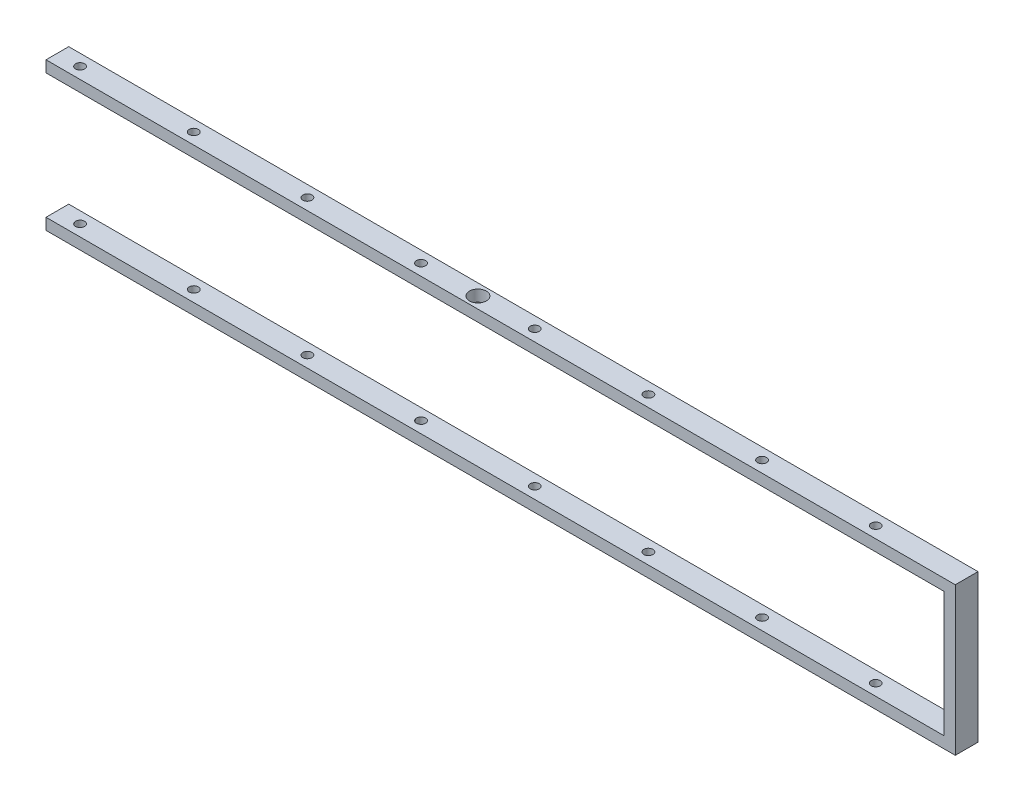
ISO-10303-21;
HEADER;
FILE_DESCRIPTION(('STEP AP214'),'2;1');
FILE_NAME('part.step','',(''),(''),'','','');
FILE_SCHEMA(('AUTOMOTIVE_DESIGN { 1 0 10303 214 1 1 1 1 }'));
ENDSEC;
DATA;
#1=APPLICATION_CONTEXT('core data for automotive mechanical design processes');
#2=APPLICATION_PROTOCOL_DEFINITION('international standard','automotive_design',2000,#1);
#3=PRODUCT_CONTEXT('',#1,'mechanical');
#4=PRODUCT('Part','Part','',(#3));
#5=PRODUCT_RELATED_PRODUCT_CATEGORY('part','',(#4));
#6=PRODUCT_DEFINITION_FORMATION('','',#4);
#7=PRODUCT_DEFINITION_CONTEXT('part definition',#1,'design');
#8=PRODUCT_DEFINITION('design','',#6,#7);
#9=PRODUCT_DEFINITION_SHAPE('','',#8);
#10=(LENGTH_UNIT() NAMED_UNIT(*) SI_UNIT(.MILLI.,.METRE.));
#11=(NAMED_UNIT(*) PLANE_ANGLE_UNIT() SI_UNIT($,.RADIAN.));
#12=(NAMED_UNIT(*) SI_UNIT($,.STERADIAN.) SOLID_ANGLE_UNIT());
#13=UNCERTAINTY_MEASURE_WITH_UNIT(LENGTH_MEASURE(1.E-05),#10,'distance_accuracy_value','');
#14=(GEOMETRIC_REPRESENTATION_CONTEXT(3) GLOBAL_UNCERTAINTY_ASSIGNED_CONTEXT((#13)) GLOBAL_UNIT_ASSIGNED_CONTEXT((#10,
#11,#12)) REPRESENTATION_CONTEXT('',''));
#15=CARTESIAN_POINT('',(0.,0.,0.));
#16=DIRECTION('',(0.,0.,1.));
#17=DIRECTION('',(1.,0.,0.));
#18=AXIS2_PLACEMENT_3D('',#15,#16,#17);
#19=CARTESIAN_POINT('',(0.,10.,20.));
#20=DIRECTION('',(0.,1.,0.));
#21=DIRECTION('',(0.,0.,1.));
#22=AXIS2_PLACEMENT_3D('',#19,#20,#21);
#23=PLANE('',#22);
#24=CARTESIAN_POINT('',(720.,10.,10.));
#25=DIRECTION('',(0.,1.,0.));
#26=DIRECTION('',(0.,0.,1.));
#27=AXIS2_PLACEMENT_3D('',#24,#25,#26);
#28=CIRCLE('',#27,4.);
#29=CARTESIAN_POINT('',(720.,10.,14.));
#30=VERTEX_POINT('',#29);
#31=EDGE_CURVE('E196',#30,#30,#28,.T.);
#32=ORIENTED_EDGE('',*,*,#31,.F.);
#33=EDGE_LOOP('',(#32));
#34=FACE_BOUND('',#33,.T.);
#35=CARTESIAN_POINT('',(620.,10.,10.));
#36=DIRECTION('',(0.,1.,0.));
#37=DIRECTION('',(0.,0.,1.));
#38=AXIS2_PLACEMENT_3D('',#35,#36,#37);
#39=CIRCLE('',#38,4.);
#40=CARTESIAN_POINT('',(620.,10.,14.));
#41=VERTEX_POINT('',#40);
#42=EDGE_CURVE('E190',#41,#41,#39,.T.);
#43=ORIENTED_EDGE('',*,*,#42,.F.);
#44=EDGE_LOOP('',(#43));
#45=FACE_BOUND('',#44,.T.);
#46=CARTESIAN_POINT('',(520.,10.,10.));
#47=DIRECTION('',(0.,1.,0.));
#48=DIRECTION('',(0.,0.,1.));
#49=AXIS2_PLACEMENT_3D('',#46,#47,#48);
#50=CIRCLE('',#49,4.);
#51=CARTESIAN_POINT('',(520.,10.,14.));
#52=VERTEX_POINT('',#51);
#53=EDGE_CURVE('E184',#52,#52,#50,.T.);
#54=ORIENTED_EDGE('',*,*,#53,.F.);
#55=EDGE_LOOP('',(#54));
#56=FACE_BOUND('',#55,.T.);
#57=CARTESIAN_POINT('',(420.,10.,10.));
#58=DIRECTION('',(0.,1.,0.));
#59=DIRECTION('',(0.,0.,1.));
#60=AXIS2_PLACEMENT_3D('',#57,#58,#59);
#61=CIRCLE('',#60,4.);
#62=CARTESIAN_POINT('',(420.,10.,14.));
#63=VERTEX_POINT('',#62);
#64=EDGE_CURVE('E178',#63,#63,#61,.T.);
#65=ORIENTED_EDGE('',*,*,#64,.F.);
#66=EDGE_LOOP('',(#65));
#67=FACE_BOUND('',#66,.T.);
#68=CARTESIAN_POINT('',(320.,10.,10.));
#69=DIRECTION('',(0.,1.,0.));
#70=DIRECTION('',(0.,0.,1.));
#71=AXIS2_PLACEMENT_3D('',#68,#69,#70);
#72=CIRCLE('',#71,4.);
#73=CARTESIAN_POINT('',(320.,10.,14.));
#74=VERTEX_POINT('',#73);
#75=EDGE_CURVE('E172',#74,#74,#72,.T.);
#76=ORIENTED_EDGE('',*,*,#75,.F.);
#77=EDGE_LOOP('',(#76));
#78=FACE_BOUND('',#77,.T.);
#79=CARTESIAN_POINT('',(220.,10.,10.));
#80=DIRECTION('',(0.,1.,0.));
#81=DIRECTION('',(0.,0.,1.));
#82=AXIS2_PLACEMENT_3D('',#79,#80,#81);
#83=CIRCLE('',#82,4.);
#84=CARTESIAN_POINT('',(220.,10.,14.));
#85=VERTEX_POINT('',#84);
#86=EDGE_CURVE('E166',#85,#85,#83,.T.);
#87=ORIENTED_EDGE('',*,*,#86,.F.);
#88=EDGE_LOOP('',(#87));
#89=FACE_BOUND('',#88,.T.);
#90=CARTESIAN_POINT('',(120.,10.,10.));
#91=DIRECTION('',(0.,1.,0.));
#92=DIRECTION('',(0.,0.,1.));
#93=AXIS2_PLACEMENT_3D('',#90,#91,#92);
#94=CIRCLE('',#93,4.);
#95=CARTESIAN_POINT('',(120.,10.,14.));
#96=VERTEX_POINT('',#95);
#97=EDGE_CURVE('E160',#96,#96,#94,.T.);
#98=ORIENTED_EDGE('',*,*,#97,.F.);
#99=EDGE_LOOP('',(#98));
#100=FACE_BOUND('',#99,.T.);
#101=CARTESIAN_POINT('',(20.,10.,10.));
#102=DIRECTION('',(0.,1.,0.));
#103=DIRECTION('',(0.,0.,1.));
#104=AXIS2_PLACEMENT_3D('',#101,#102,#103);
#105=CIRCLE('',#104,4.);
#106=CARTESIAN_POINT('',(20.,10.,14.));
#107=VERTEX_POINT('',#106);
#108=EDGE_CURVE('E147',#107,#107,#105,.T.);
#109=ORIENTED_EDGE('',*,*,#108,.F.);
#110=EDGE_LOOP('',(#109));
#111=FACE_BOUND('',#110,.T.);
#112=DIRECTION('',(1.,0.,0.));
#113=VECTOR('',#112,1.);
#114=CARTESIAN_POINT('',(0.,10.,0.));
#115=LINE('',#114,#113);
#116=CARTESIAN_POINT('',(0.,10.,0.));
#117=VERTEX_POINT('',#116);
#118=CARTESIAN_POINT('',(790.,10.,0.));
#119=VERTEX_POINT('',#118);
#120=EDGE_CURVE('E150',#117,#119,#115,.T.);
#121=ORIENTED_EDGE('',*,*,#120,.F.);
#122=DIRECTION('',(0.,0.,-1.));
#123=VECTOR('',#122,1.);
#124=CARTESIAN_POINT('',(0.,10.,20.));
#125=LINE('',#124,#123);
#126=CARTESIAN_POINT('',(0.,10.,20.));
#127=VERTEX_POINT('',#126);
#128=EDGE_CURVE('E11',#127,#117,#125,.T.);
#129=ORIENTED_EDGE('',*,*,#128,.F.);
#130=DIRECTION('',(1.,0.,0.));
#131=VECTOR('',#130,1.);
#132=CARTESIAN_POINT('',(0.,10.,20.));
#133=LINE('',#132,#131);
#134=CARTESIAN_POINT('',(790.,10.,20.));
#135=VERTEX_POINT('',#134);
#136=EDGE_CURVE('E139',#127,#135,#133,.T.);
#137=ORIENTED_EDGE('',*,*,#136,.T.);
#138=DIRECTION('',(0.,0.,-1.));
#139=VECTOR('',#138,1.);
#140=CARTESIAN_POINT('',(790.,10.,20.));
#141=LINE('',#140,#139);
#142=EDGE_CURVE('E59',#135,#119,#141,.T.);
#143=ORIENTED_EDGE('',*,*,#142,.T.);
#144=EDGE_LOOP('',(#121,#129,#137,#143));
#145=FACE_BOUND('',#144,.T.);
#146=ADVANCED_FACE('F42',(#34,#45,#56,#67,#78,#89,#100,#111,#145),#23,.T.);
#147=CARTESIAN_POINT('',(0.,0.,20.));
#148=DIRECTION('',(-1.,0.,0.));
#149=DIRECTION('',(0.,0.,1.));
#150=AXIS2_PLACEMENT_3D('',#147,#148,#149);
#151=PLANE('',#150);
#152=DIRECTION('',(0.,1.,0.));
#153=VECTOR('',#152,1.);
#154=CARTESIAN_POINT('',(0.,0.,0.));
#155=LINE('',#154,#153);
#156=CARTESIAN_POINT('',(0.,0.,0.));
#157=VERTEX_POINT('',#156);
#158=EDGE_CURVE('E290',#157,#117,#155,.T.);
#159=ORIENTED_EDGE('',*,*,#158,.F.);
#160=DIRECTION('',(0.,0.,-1.));
#161=VECTOR('',#160,1.);
#162=CARTESIAN_POINT('',(0.,0.,20.));
#163=LINE('',#162,#161);
#164=CARTESIAN_POINT('',(0.,0.,20.));
#165=VERTEX_POINT('',#164);
#166=EDGE_CURVE('E51',#165,#157,#163,.T.);
#167=ORIENTED_EDGE('',*,*,#166,.F.);
#168=DIRECTION('',(0.,1.,0.));
#169=VECTOR('',#168,1.);
#170=CARTESIAN_POINT('',(0.,0.,20.));
#171=LINE('',#170,#169);
#172=EDGE_CURVE('E132',#165,#127,#171,.T.);
#173=ORIENTED_EDGE('',*,*,#172,.T.);
#174=ORIENTED_EDGE('',*,*,#128,.T.);
#175=EDGE_LOOP('',(#159,#167,#173,#174));
#176=FACE_BOUND('',#175,.T.);
#177=ADVANCED_FACE('F312',(#176),#151,.T.);
#178=CARTESIAN_POINT('',(0.,0.,20.));
#179=DIRECTION('',(0.,1.,0.));
#180=DIRECTION('',(0.,0.,1.));
#181=AXIS2_PLACEMENT_3D('',#178,#179,#180);
#182=PLANE('',#181);
#183=CARTESIAN_POINT('',(720.,0.,10.));
#184=DIRECTION('',(0.,1.,0.));
#185=DIRECTION('',(0.,0.,1.));
#186=AXIS2_PLACEMENT_3D('',#183,#184,#185);
#187=CIRCLE('',#186,4.);
#188=CARTESIAN_POINT('',(720.,0.,14.));
#189=VERTEX_POINT('',#188);
#190=EDGE_CURVE('E193',#189,#189,#187,.T.);
#191=ORIENTED_EDGE('',*,*,#190,.T.);
#192=EDGE_LOOP('',(#191));
#193=FACE_BOUND('',#192,.T.);
#194=CARTESIAN_POINT('',(620.,0.,10.));
#195=DIRECTION('',(0.,1.,0.));
#196=DIRECTION('',(0.,0.,1.));
#197=AXIS2_PLACEMENT_3D('',#194,#195,#196);
#198=CIRCLE('',#197,4.);
#199=CARTESIAN_POINT('',(620.,0.,14.));
#200=VERTEX_POINT('',#199);
#201=EDGE_CURVE('E187',#200,#200,#198,.T.);
#202=ORIENTED_EDGE('',*,*,#201,.T.);
#203=EDGE_LOOP('',(#202));
#204=FACE_BOUND('',#203,.T.);
#205=CARTESIAN_POINT('',(520.,0.,10.));
#206=DIRECTION('',(0.,1.,0.));
#207=DIRECTION('',(0.,0.,1.));
#208=AXIS2_PLACEMENT_3D('',#205,#206,#207);
#209=CIRCLE('',#208,4.);
#210=CARTESIAN_POINT('',(520.,0.,14.));
#211=VERTEX_POINT('',#210);
#212=EDGE_CURVE('E181',#211,#211,#209,.T.);
#213=ORIENTED_EDGE('',*,*,#212,.T.);
#214=EDGE_LOOP('',(#213));
#215=FACE_BOUND('',#214,.T.);
#216=CARTESIAN_POINT('',(420.,0.,10.));
#217=DIRECTION('',(0.,1.,0.));
#218=DIRECTION('',(0.,0.,1.));
#219=AXIS2_PLACEMENT_3D('',#216,#217,#218);
#220=CIRCLE('',#219,4.);
#221=CARTESIAN_POINT('',(420.,0.,14.));
#222=VERTEX_POINT('',#221);
#223=EDGE_CURVE('E175',#222,#222,#220,.T.);
#224=ORIENTED_EDGE('',*,*,#223,.T.);
#225=EDGE_LOOP('',(#224));
#226=FACE_BOUND('',#225,.T.);
#227=CARTESIAN_POINT('',(320.,0.,10.));
#228=DIRECTION('',(0.,1.,0.));
#229=DIRECTION('',(0.,0.,1.));
#230=AXIS2_PLACEMENT_3D('',#227,#228,#229);
#231=CIRCLE('',#230,4.);
#232=CARTESIAN_POINT('',(320.,0.,14.));
#233=VERTEX_POINT('',#232);
#234=EDGE_CURVE('E169',#233,#233,#231,.T.);
#235=ORIENTED_EDGE('',*,*,#234,.T.);
#236=EDGE_LOOP('',(#235));
#237=FACE_BOUND('',#236,.T.);
#238=CARTESIAN_POINT('',(220.,0.,10.));
#239=DIRECTION('',(0.,1.,0.));
#240=DIRECTION('',(0.,0.,1.));
#241=AXIS2_PLACEMENT_3D('',#238,#239,#240);
#242=CIRCLE('',#241,4.);
#243=CARTESIAN_POINT('',(220.,0.,14.));
#244=VERTEX_POINT('',#243);
#245=EDGE_CURVE('E163',#244,#244,#242,.T.);
#246=ORIENTED_EDGE('',*,*,#245,.T.);
#247=EDGE_LOOP('',(#246));
#248=FACE_BOUND('',#247,.T.);
#249=CARTESIAN_POINT('',(120.,0.,10.));
#250=DIRECTION('',(0.,1.,0.));
#251=DIRECTION('',(0.,0.,1.));
#252=AXIS2_PLACEMENT_3D('',#249,#250,#251);
#253=CIRCLE('',#252,4.);
#254=CARTESIAN_POINT('',(120.,0.,14.));
#255=VERTEX_POINT('',#254);
#256=EDGE_CURVE('E155',#255,#255,#253,.T.);
#257=ORIENTED_EDGE('',*,*,#256,.T.);
#258=EDGE_LOOP('',(#257));
#259=FACE_BOUND('',#258,.T.);
#260=CARTESIAN_POINT('',(20.,0.,10.));
#261=DIRECTION('',(0.,1.,0.));
#262=DIRECTION('',(0.,0.,1.));
#263=AXIS2_PLACEMENT_3D('',#260,#261,#262);
#264=CIRCLE('',#263,4.);
#265=CARTESIAN_POINT('',(20.,0.,14.));
#266=VERTEX_POINT('',#265);
#267=EDGE_CURVE('E154',#266,#266,#264,.T.);
#268=ORIENTED_EDGE('',*,*,#267,.T.);
#269=EDGE_LOOP('',(#268));
#270=FACE_BOUND('',#269,.T.);
#271=DIRECTION('',(1.,0.,0.));
#272=VECTOR('',#271,1.);
#273=CARTESIAN_POINT('',(0.,0.,0.));
#274=LINE('',#273,#272);
#275=CARTESIAN_POINT('',(800.,0.,0.));
#276=VERTEX_POINT('',#275);
#277=EDGE_CURVE('E295',#157,#276,#274,.T.);
#278=ORIENTED_EDGE('',*,*,#277,.T.);
#279=DIRECTION('',(0.,0.,-1.));
#280=VECTOR('',#279,1.);
#281=CARTESIAN_POINT('',(800.,0.,20.));
#282=LINE('',#281,#280);
#283=CARTESIAN_POINT('',(800.,0.,20.));
#284=VERTEX_POINT('',#283);
#285=EDGE_CURVE('E305',#284,#276,#282,.T.);
#286=ORIENTED_EDGE('',*,*,#285,.F.);
#287=DIRECTION('',(1.,0.,0.));
#288=VECTOR('',#287,1.);
#289=CARTESIAN_POINT('',(0.,0.,20.));
#290=LINE('',#289,#288);
#291=EDGE_CURVE('E138',#165,#284,#290,.T.);
#292=ORIENTED_EDGE('',*,*,#291,.F.);
#293=ORIENTED_EDGE('',*,*,#166,.T.);
#294=EDGE_LOOP('',(#278,#286,#292,#293));
#295=FACE_BOUND('',#294,.T.);
#296=ADVANCED_FACE('F311',(#193,#204,#215,#226,#237,#248,#259,#270,#295),#182,.F.);
#297=CARTESIAN_POINT('',(800.,0.,20.));
#298=DIRECTION('',(-1.,0.,0.));
#299=DIRECTION('',(0.,0.,1.));
#300=AXIS2_PLACEMENT_3D('',#297,#298,#299);
#301=PLANE('',#300);
#302=DIRECTION('',(0.,1.,0.));
#303=VECTOR('',#302,1.);
#304=CARTESIAN_POINT('',(800.,0.,0.));
#305=LINE('',#304,#303);
#306=CARTESIAN_POINT('',(800.,130.,0.));
#307=VERTEX_POINT('',#306);
#308=EDGE_CURVE('E286',#276,#307,#305,.T.);
#309=ORIENTED_EDGE('',*,*,#308,.T.);
#310=DIRECTION('',(0.,0.,-1.));
#311=VECTOR('',#310,1.);
#312=CARTESIAN_POINT('',(800.,130.,20.));
#313=LINE('',#312,#311);
#314=CARTESIAN_POINT('',(800.,130.,20.));
#315=VERTEX_POINT('',#314);
#316=EDGE_CURVE('E282',#315,#307,#313,.T.);
#317=ORIENTED_EDGE('',*,*,#316,.F.);
#318=DIRECTION('',(0.,1.,0.));
#319=VECTOR('',#318,1.);
#320=CARTESIAN_POINT('',(800.,0.,20.));
#321=LINE('',#320,#319);
#322=EDGE_CURVE('E133',#284,#315,#321,.T.);
#323=ORIENTED_EDGE('',*,*,#322,.F.);
#324=ORIENTED_EDGE('',*,*,#285,.T.);
#325=EDGE_LOOP('',(#309,#317,#323,#324));
#326=FACE_BOUND('',#325,.T.);
#327=ADVANCED_FACE('F260',(#326),#301,.F.);
#328=CARTESIAN_POINT('',(0.,130.,20.));
#329=DIRECTION('',(0.,1.,0.));
#330=DIRECTION('',(0.,0.,1.));
#331=AXIS2_PLACEMENT_3D('',#328,#329,#330);
#332=PLANE('',#331);
#333=CARTESIAN_POINT('',(370.,130.,10.));
#334=DIRECTION('',(0.,1.,0.));
#335=DIRECTION('',(0.,0.,1.));
#336=AXIS2_PLACEMENT_3D('',#333,#334,#335);
#337=CIRCLE('',#336,7.50000000000001);
#338=CARTESIAN_POINT('',(370.,130.,17.5));
#339=VERTEX_POINT('',#338);
#340=EDGE_CURVE('E242',#339,#339,#337,.T.);
#341=ORIENTED_EDGE('',*,*,#340,.F.);
#342=EDGE_LOOP('',(#341));
#343=FACE_BOUND('',#342,.T.);
#344=CARTESIAN_POINT('',(720.,130.,10.));
#345=DIRECTION('',(0.,1.,0.));
#346=DIRECTION('',(0.,0.,1.));
#347=AXIS2_PLACEMENT_3D('',#344,#345,#346);
#348=CIRCLE('',#347,4.);
#349=CARTESIAN_POINT('',(720.,130.,14.));
#350=VERTEX_POINT('',#349);
#351=EDGE_CURVE('E238',#350,#350,#348,.T.);
#352=ORIENTED_EDGE('',*,*,#351,.F.);
#353=EDGE_LOOP('',(#352));
#354=FACE_BOUND('',#353,.T.);
#355=CARTESIAN_POINT('',(620.,130.,10.));
#356=DIRECTION('',(0.,1.,0.));
#357=DIRECTION('',(0.,0.,1.));
#358=AXIS2_PLACEMENT_3D('',#355,#356,#357);
#359=CIRCLE('',#358,4.);
#360=CARTESIAN_POINT('',(620.,130.,14.));
#361=VERTEX_POINT('',#360);
#362=EDGE_CURVE('E232',#361,#361,#359,.T.);
#363=ORIENTED_EDGE('',*,*,#362,.F.);
#364=EDGE_LOOP('',(#363));
#365=FACE_BOUND('',#364,.T.);
#366=CARTESIAN_POINT('',(520.,130.,10.));
#367=DIRECTION('',(0.,1.,0.));
#368=DIRECTION('',(0.,0.,1.));
#369=AXIS2_PLACEMENT_3D('',#366,#367,#368);
#370=CIRCLE('',#369,4.);
#371=CARTESIAN_POINT('',(520.,130.,14.));
#372=VERTEX_POINT('',#371);
#373=EDGE_CURVE('E226',#372,#372,#370,.T.);
#374=ORIENTED_EDGE('',*,*,#373,.F.);
#375=EDGE_LOOP('',(#374));
#376=FACE_BOUND('',#375,.T.);
#377=CARTESIAN_POINT('',(420.,130.,10.));
#378=DIRECTION('',(0.,1.,0.));
#379=DIRECTION('',(0.,0.,1.));
#380=AXIS2_PLACEMENT_3D('',#377,#378,#379);
#381=CIRCLE('',#380,4.);
#382=CARTESIAN_POINT('',(420.,130.,14.));
#383=VERTEX_POINT('',#382);
#384=EDGE_CURVE('E220',#383,#383,#381,.T.);
#385=ORIENTED_EDGE('',*,*,#384,.F.);
#386=EDGE_LOOP('',(#385));
#387=FACE_BOUND('',#386,.T.);
#388=CARTESIAN_POINT('',(320.,130.,10.));
#389=DIRECTION('',(0.,1.,0.));
#390=DIRECTION('',(0.,0.,1.));
#391=AXIS2_PLACEMENT_3D('',#388,#389,#390);
#392=CIRCLE('',#391,4.);
#393=CARTESIAN_POINT('',(320.,130.,14.));
#394=VERTEX_POINT('',#393);
#395=EDGE_CURVE('E214',#394,#394,#392,.T.);
#396=ORIENTED_EDGE('',*,*,#395,.F.);
#397=EDGE_LOOP('',(#396));
#398=FACE_BOUND('',#397,.T.);
#399=CARTESIAN_POINT('',(220.,130.,10.));
#400=DIRECTION('',(0.,1.,0.));
#401=DIRECTION('',(0.,0.,1.));
#402=AXIS2_PLACEMENT_3D('',#399,#400,#401);
#403=CIRCLE('',#402,4.);
#404=CARTESIAN_POINT('',(220.,130.,14.));
#405=VERTEX_POINT('',#404);
#406=EDGE_CURVE('E208',#405,#405,#403,.T.);
#407=ORIENTED_EDGE('',*,*,#406,.F.);
#408=EDGE_LOOP('',(#407));
#409=FACE_BOUND('',#408,.T.);
#410=CARTESIAN_POINT('',(120.,130.,10.));
#411=DIRECTION('',(0.,1.,0.));
#412=DIRECTION('',(0.,0.,1.));
#413=AXIS2_PLACEMENT_3D('',#410,#411,#412);
#414=CIRCLE('',#413,4.);
#415=CARTESIAN_POINT('',(120.,130.,14.));
#416=VERTEX_POINT('',#415);
#417=EDGE_CURVE('E202',#416,#416,#414,.T.);
#418=ORIENTED_EDGE('',*,*,#417,.F.);
#419=EDGE_LOOP('',(#418));
#420=FACE_BOUND('',#419,.T.);
#421=CARTESIAN_POINT('',(20.,130.,10.));
#422=DIRECTION('',(0.,1.,0.));
#423=DIRECTION('',(0.,0.,1.));
#424=AXIS2_PLACEMENT_3D('',#421,#422,#423);
#425=CIRCLE('',#424,4.);
#426=CARTESIAN_POINT('',(20.,130.,14.));
#427=VERTEX_POINT('',#426);
#428=EDGE_CURVE('E151',#427,#427,#425,.T.);
#429=ORIENTED_EDGE('',*,*,#428,.F.);
#430=EDGE_LOOP('',(#429));
#431=FACE_BOUND('',#430,.T.);
#432=DIRECTION('',(1.,0.,0.));
#433=VECTOR('',#432,1.);
#434=CARTESIAN_POINT('',(0.,130.,0.));
#435=LINE('',#434,#433);
#436=CARTESIAN_POINT('',(0.,130.,0.));
#437=VERTEX_POINT('',#436);
#438=EDGE_CURVE('E280',#437,#307,#435,.T.);
#439=ORIENTED_EDGE('',*,*,#438,.F.);
#440=DIRECTION('',(0.,0.,-1.));
#441=VECTOR('',#440,1.);
#442=CARTESIAN_POINT('',(0.,130.,20.));
#443=LINE('',#442,#441);
#444=CARTESIAN_POINT('',(0.,130.,20.));
#445=VERTEX_POINT('',#444);
#446=EDGE_CURVE('E119',#445,#437,#443,.T.);
#447=ORIENTED_EDGE('',*,*,#446,.F.);
#448=DIRECTION('',(1.,0.,0.));
#449=VECTOR('',#448,1.);
#450=CARTESIAN_POINT('',(0.,130.,20.));
#451=LINE('',#450,#449);
#452=EDGE_CURVE('E130',#445,#315,#451,.T.);
#453=ORIENTED_EDGE('',*,*,#452,.T.);
#454=ORIENTED_EDGE('',*,*,#316,.T.);
#455=EDGE_LOOP('',(#439,#447,#453,#454));
#456=FACE_BOUND('',#455,.T.);
#457=ADVANCED_FACE('F257',(#343,#354,#365,#376,#387,#398,#409,#420,#431,#456),#332,.T.);
#458=CARTESIAN_POINT('',(0.,120.,0.));
#459=VERTEX_POINT('',#458);
#460=EDGE_CURVE('E116',#459,#437,#155,.T.);
#461=ORIENTED_EDGE('',*,*,#460,.F.);
#462=DIRECTION('',(0.,0.,-1.));
#463=VECTOR('',#462,1.);
#464=CARTESIAN_POINT('',(0.,120.,20.));
#465=LINE('',#464,#463);
#466=CARTESIAN_POINT('',(0.,120.,20.));
#467=VERTEX_POINT('',#466);
#468=EDGE_CURVE('E110',#467,#459,#465,.T.);
#469=ORIENTED_EDGE('',*,*,#468,.F.);
#470=EDGE_CURVE('E114',#467,#445,#171,.T.);
#471=ORIENTED_EDGE('',*,*,#470,.T.);
#472=ORIENTED_EDGE('',*,*,#446,.T.);
#473=EDGE_LOOP('',(#461,#469,#471,#472));
#474=FACE_BOUND('',#473,.T.);
#475=ADVANCED_FACE('F112',(#474),#151,.T.);
#476=CARTESIAN_POINT('',(0.,120.,20.));
#477=DIRECTION('',(0.,1.,0.));
#478=DIRECTION('',(-1.,0.,0.));
#479=AXIS2_PLACEMENT_3D('',#476,#477,#478);
#480=PLANE('',#479);
#481=CARTESIAN_POINT('',(370.,120.,10.));
#482=DIRECTION('',(0.,1.,0.));
#483=DIRECTION('',(0.,0.,1.));
#484=AXIS2_PLACEMENT_3D('',#481,#482,#483);
#485=CIRCLE('',#484,7.50000000000001);
#486=CARTESIAN_POINT('',(370.,120.,17.5));
#487=VERTEX_POINT('',#486);
#488=EDGE_CURVE('E241',#487,#487,#485,.T.);
#489=ORIENTED_EDGE('',*,*,#488,.T.);
#490=EDGE_LOOP('',(#489));
#491=FACE_BOUND('',#490,.T.);
#492=CARTESIAN_POINT('',(720.,120.,10.));
#493=DIRECTION('',(0.,1.,0.));
#494=DIRECTION('',(-1.,0.,0.));
#495=AXIS2_PLACEMENT_3D('',#492,#493,#494);
#496=CIRCLE('',#495,4.);
#497=CARTESIAN_POINT('',(716.,120.,10.));
#498=VERTEX_POINT('',#497);
#499=EDGE_CURVE('E235',#498,#498,#496,.T.);
#500=ORIENTED_EDGE('',*,*,#499,.T.);
#501=EDGE_LOOP('',(#500));
#502=FACE_BOUND('',#501,.T.);
#503=CARTESIAN_POINT('',(620.,120.,10.));
#504=DIRECTION('',(0.,1.,0.));
#505=DIRECTION('',(-1.,0.,0.));
#506=AXIS2_PLACEMENT_3D('',#503,#504,#505);
#507=CIRCLE('',#506,4.);
#508=CARTESIAN_POINT('',(616.,120.,10.));
#509=VERTEX_POINT('',#508);
#510=EDGE_CURVE('E229',#509,#509,#507,.T.);
#511=ORIENTED_EDGE('',*,*,#510,.T.);
#512=EDGE_LOOP('',(#511));
#513=FACE_BOUND('',#512,.T.);
#514=CARTESIAN_POINT('',(520.,120.,10.));
#515=DIRECTION('',(0.,1.,0.));
#516=DIRECTION('',(-1.,0.,0.));
#517=AXIS2_PLACEMENT_3D('',#514,#515,#516);
#518=CIRCLE('',#517,4.);
#519=CARTESIAN_POINT('',(516.,120.,10.));
#520=VERTEX_POINT('',#519);
#521=EDGE_CURVE('E223',#520,#520,#518,.T.);
#522=ORIENTED_EDGE('',*,*,#521,.T.);
#523=EDGE_LOOP('',(#522));
#524=FACE_BOUND('',#523,.T.);
#525=CARTESIAN_POINT('',(420.,120.,10.));
#526=DIRECTION('',(0.,1.,0.));
#527=DIRECTION('',(-1.,0.,0.));
#528=AXIS2_PLACEMENT_3D('',#525,#526,#527);
#529=CIRCLE('',#528,4.);
#530=CARTESIAN_POINT('',(416.,120.,10.));
#531=VERTEX_POINT('',#530);
#532=EDGE_CURVE('E217',#531,#531,#529,.T.);
#533=ORIENTED_EDGE('',*,*,#532,.T.);
#534=EDGE_LOOP('',(#533));
#535=FACE_BOUND('',#534,.T.);
#536=CARTESIAN_POINT('',(320.,120.,10.));
#537=DIRECTION('',(0.,1.,0.));
#538=DIRECTION('',(-1.,0.,0.));
#539=AXIS2_PLACEMENT_3D('',#536,#537,#538);
#540=CIRCLE('',#539,4.);
#541=CARTESIAN_POINT('',(316.,120.,10.));
#542=VERTEX_POINT('',#541);
#543=EDGE_CURVE('E211',#542,#542,#540,.T.);
#544=ORIENTED_EDGE('',*,*,#543,.T.);
#545=EDGE_LOOP('',(#544));
#546=FACE_BOUND('',#545,.T.);
#547=CARTESIAN_POINT('',(220.,120.,10.));
#548=DIRECTION('',(0.,1.,0.));
#549=DIRECTION('',(-1.,0.,0.));
#550=AXIS2_PLACEMENT_3D('',#547,#548,#549);
#551=CIRCLE('',#550,4.);
#552=CARTESIAN_POINT('',(216.,120.,10.));
#553=VERTEX_POINT('',#552);
#554=EDGE_CURVE('E205',#553,#553,#551,.T.);
#555=ORIENTED_EDGE('',*,*,#554,.T.);
#556=EDGE_LOOP('',(#555));
#557=FACE_BOUND('',#556,.T.);
#558=CARTESIAN_POINT('',(120.,120.,10.));
#559=DIRECTION('',(0.,1.,0.));
#560=DIRECTION('',(-1.,0.,0.));
#561=AXIS2_PLACEMENT_3D('',#558,#559,#560);
#562=CIRCLE('',#561,4.);
#563=CARTESIAN_POINT('',(116.,120.,10.));
#564=VERTEX_POINT('',#563);
#565=EDGE_CURVE('E199',#564,#564,#562,.T.);
#566=ORIENTED_EDGE('',*,*,#565,.T.);
#567=EDGE_LOOP('',(#566));
#568=FACE_BOUND('',#567,.T.);
#569=CARTESIAN_POINT('',(20.,120.,10.));
#570=DIRECTION('',(0.,1.,0.));
#571=DIRECTION('',(-1.,0.,0.));
#572=AXIS2_PLACEMENT_3D('',#569,#570,#571);
#573=CIRCLE('',#572,4.);
#574=CARTESIAN_POINT('',(16.,120.,10.));
#575=VERTEX_POINT('',#574);
#576=EDGE_CURVE('E45',#575,#575,#573,.T.);
#577=ORIENTED_EDGE('',*,*,#576,.T.);
#578=EDGE_LOOP('',(#577));
#579=FACE_BOUND('',#578,.T.);
#580=DIRECTION('',(1.,0.,0.));
#581=VECTOR('',#580,1.);
#582=CARTESIAN_POINT('',(0.,120.,0.));
#583=LINE('',#582,#581);
#584=CARTESIAN_POINT('',(790.,120.,0.));
#585=VERTEX_POINT('',#584);
#586=EDGE_CURVE('E144',#459,#585,#583,.T.);
#587=ORIENTED_EDGE('',*,*,#586,.T.);
#588=DIRECTION('',(0.,0.,-1.));
#589=VECTOR('',#588,1.);
#590=CARTESIAN_POINT('',(790.,120.,20.));
#591=LINE('',#590,#589);
#592=CARTESIAN_POINT('',(790.,120.,20.));
#593=VERTEX_POINT('',#592);
#594=EDGE_CURVE('E85',#593,#585,#591,.T.);
#595=ORIENTED_EDGE('',*,*,#594,.F.);
#596=DIRECTION('',(1.,0.,0.));
#597=VECTOR('',#596,1.);
#598=CARTESIAN_POINT('',(0.,120.,20.));
#599=LINE('',#598,#597);
#600=EDGE_CURVE('E121',#467,#593,#599,.T.);
#601=ORIENTED_EDGE('',*,*,#600,.F.);
#602=ORIENTED_EDGE('',*,*,#468,.T.);
#603=EDGE_LOOP('',(#587,#595,#601,#602));
#604=FACE_BOUND('',#603,.T.);
#605=ADVANCED_FACE('F122',(#491,#502,#513,#524,#535,#546,#557,#568,#579,#604),#480,.F.);
#606=CARTESIAN_POINT('',(790.,0.,20.));
#607=DIRECTION('',(-1.,0.,0.));
#608=DIRECTION('',(0.,0.,1.));
#609=AXIS2_PLACEMENT_3D('',#606,#607,#608);
#610=PLANE('',#609);
#611=DIRECTION('',(0.,1.,0.));
#612=VECTOR('',#611,1.);
#613=CARTESIAN_POINT('',(790.,0.,0.));
#614=LINE('',#613,#612);
#615=EDGE_CURVE('E142',#119,#585,#614,.T.);
#616=ORIENTED_EDGE('',*,*,#615,.F.);
#617=ORIENTED_EDGE('',*,*,#142,.F.);
#618=DIRECTION('',(0.,1.,0.));
#619=VECTOR('',#618,1.);
#620=CARTESIAN_POINT('',(790.,0.,20.));
#621=LINE('',#620,#619);
#622=EDGE_CURVE('E125',#135,#593,#621,.T.);
#623=ORIENTED_EDGE('',*,*,#622,.T.);
#624=ORIENTED_EDGE('',*,*,#594,.T.);
#625=EDGE_LOOP('',(#616,#617,#623,#624));
#626=FACE_BOUND('',#625,.T.);
#627=ADVANCED_FACE('F354',(#626),#610,.T.);
#628=CARTESIAN_POINT('',(0.,0.,20.));
#629=DIRECTION('',(0.,0.,1.));
#630=DIRECTION('',(1.,0.,0.));
#631=AXIS2_PLACEMENT_3D('',#628,#629,#630);
#632=PLANE('',#631);
#633=ORIENTED_EDGE('',*,*,#136,.F.);
#634=ORIENTED_EDGE('',*,*,#172,.F.);
#635=ORIENTED_EDGE('',*,*,#291,.T.);
#636=ORIENTED_EDGE('',*,*,#322,.T.);
#637=ORIENTED_EDGE('',*,*,#452,.F.);
#638=ORIENTED_EDGE('',*,*,#470,.F.);
#639=ORIENTED_EDGE('',*,*,#600,.T.);
#640=ORIENTED_EDGE('',*,*,#622,.F.);
#641=EDGE_LOOP('',(#633,#634,#635,#636,#637,#638,#639,#640));
#642=FACE_BOUND('',#641,.T.);
#643=ADVANCED_FACE('F128',(#642),#632,.T.);
#644=CARTESIAN_POINT('',(0.,0.,0.));
#645=DIRECTION('',(0.,0.,1.));
#646=DIRECTION('',(1.,0.,0.));
#647=AXIS2_PLACEMENT_3D('',#644,#645,#646);
#648=PLANE('',#647);
#649=ORIENTED_EDGE('',*,*,#120,.T.);
#650=ORIENTED_EDGE('',*,*,#615,.T.);
#651=ORIENTED_EDGE('',*,*,#586,.F.);
#652=ORIENTED_EDGE('',*,*,#460,.T.);
#653=ORIENTED_EDGE('',*,*,#438,.T.);
#654=ORIENTED_EDGE('',*,*,#308,.F.);
#655=ORIENTED_EDGE('',*,*,#277,.F.);
#656=ORIENTED_EDGE('',*,*,#158,.T.);
#657=EDGE_LOOP('',(#649,#650,#651,#652,#653,#654,#655,#656));
#658=FACE_BOUND('',#657,.T.);
#659=ADVANCED_FACE('F288',(#658),#648,.F.);
#660=CARTESIAN_POINT('',(20.,0.,10.));
#661=DIRECTION('',(0.,1.,0.));
#662=DIRECTION('',(0.,0.,1.));
#663=AXIS2_PLACEMENT_3D('',#660,#661,#662);
#664=CYLINDRICAL_SURFACE('',#663,4.);
#665=ORIENTED_EDGE('',*,*,#428,.T.);
#666=EDGE_LOOP('',(#665));
#667=FACE_BOUND('',#666,.T.);
#668=ORIENTED_EDGE('',*,*,#576,.F.);
#669=EDGE_LOOP('',(#668));
#670=FACE_BOUND('',#669,.T.);
#671=ADVANCED_FACE('F339',(#667,#670),#664,.F.);
#672=ORIENTED_EDGE('',*,*,#108,.T.);
#673=EDGE_LOOP('',(#672));
#674=FACE_BOUND('',#673,.T.);
#675=ORIENTED_EDGE('',*,*,#267,.F.);
#676=EDGE_LOOP('',(#675));
#677=FACE_BOUND('',#676,.T.);
#678=ADVANCED_FACE('F335',(#674,#677),#664,.F.);
#679=CARTESIAN_POINT('',(120.,0.,10.));
#680=DIRECTION('',(0.,1.,0.));
#681=DIRECTION('',(0.,0.,1.));
#682=AXIS2_PLACEMENT_3D('',#679,#680,#681);
#683=CYLINDRICAL_SURFACE('',#682,4.);
#684=ORIENTED_EDGE('',*,*,#97,.T.);
#685=EDGE_LOOP('',(#684));
#686=FACE_BOUND('',#685,.T.);
#687=ORIENTED_EDGE('',*,*,#256,.F.);
#688=EDGE_LOOP('',(#687));
#689=FACE_BOUND('',#688,.T.);
#690=ADVANCED_FACE('F338',(#686,#689),#683,.F.);
#691=CARTESIAN_POINT('',(220.,0.,10.));
#692=DIRECTION('',(0.,1.,0.));
#693=DIRECTION('',(0.,0.,1.));
#694=AXIS2_PLACEMENT_3D('',#691,#692,#693);
#695=CYLINDRICAL_SURFACE('',#694,4.);
#696=ORIENTED_EDGE('',*,*,#86,.T.);
#697=EDGE_LOOP('',(#696));
#698=FACE_BOUND('',#697,.T.);
#699=ORIENTED_EDGE('',*,*,#245,.F.);
#700=EDGE_LOOP('',(#699));
#701=FACE_BOUND('',#700,.T.);
#702=ADVANCED_FACE('F363',(#698,#701),#695,.F.);
#703=CARTESIAN_POINT('',(320.,0.,10.));
#704=DIRECTION('',(0.,1.,0.));
#705=DIRECTION('',(0.,0.,1.));
#706=AXIS2_PLACEMENT_3D('',#703,#704,#705);
#707=CYLINDRICAL_SURFACE('',#706,4.);
#708=ORIENTED_EDGE('',*,*,#75,.T.);
#709=EDGE_LOOP('',(#708));
#710=FACE_BOUND('',#709,.T.);
#711=ORIENTED_EDGE('',*,*,#234,.F.);
#712=EDGE_LOOP('',(#711));
#713=FACE_BOUND('',#712,.T.);
#714=ADVANCED_FACE('F367',(#710,#713),#707,.F.);
#715=CARTESIAN_POINT('',(420.,0.,10.));
#716=DIRECTION('',(0.,1.,0.));
#717=DIRECTION('',(0.,0.,1.));
#718=AXIS2_PLACEMENT_3D('',#715,#716,#717);
#719=CYLINDRICAL_SURFACE('',#718,4.);
#720=ORIENTED_EDGE('',*,*,#64,.T.);
#721=EDGE_LOOP('',(#720));
#722=FACE_BOUND('',#721,.T.);
#723=ORIENTED_EDGE('',*,*,#223,.F.);
#724=EDGE_LOOP('',(#723));
#725=FACE_BOUND('',#724,.T.);
#726=ADVANCED_FACE('F371',(#722,#725),#719,.F.);
#727=CARTESIAN_POINT('',(520.,0.,10.));
#728=DIRECTION('',(0.,1.,0.));
#729=DIRECTION('',(0.,0.,1.));
#730=AXIS2_PLACEMENT_3D('',#727,#728,#729);
#731=CYLINDRICAL_SURFACE('',#730,4.);
#732=ORIENTED_EDGE('',*,*,#53,.T.);
#733=EDGE_LOOP('',(#732));
#734=FACE_BOUND('',#733,.T.);
#735=ORIENTED_EDGE('',*,*,#212,.F.);
#736=EDGE_LOOP('',(#735));
#737=FACE_BOUND('',#736,.T.);
#738=ADVANCED_FACE('F375',(#734,#737),#731,.F.);
#739=CARTESIAN_POINT('',(620.,0.,10.));
#740=DIRECTION('',(0.,1.,0.));
#741=DIRECTION('',(0.,0.,1.));
#742=AXIS2_PLACEMENT_3D('',#739,#740,#741);
#743=CYLINDRICAL_SURFACE('',#742,4.);
#744=ORIENTED_EDGE('',*,*,#42,.T.);
#745=EDGE_LOOP('',(#744));
#746=FACE_BOUND('',#745,.T.);
#747=ORIENTED_EDGE('',*,*,#201,.F.);
#748=EDGE_LOOP('',(#747));
#749=FACE_BOUND('',#748,.T.);
#750=ADVANCED_FACE('F379',(#746,#749),#743,.F.);
#751=CARTESIAN_POINT('',(720.,0.,10.));
#752=DIRECTION('',(0.,1.,0.));
#753=DIRECTION('',(0.,0.,1.));
#754=AXIS2_PLACEMENT_3D('',#751,#752,#753);
#755=CYLINDRICAL_SURFACE('',#754,4.);
#756=ORIENTED_EDGE('',*,*,#31,.T.);
#757=EDGE_LOOP('',(#756));
#758=FACE_BOUND('',#757,.T.);
#759=ORIENTED_EDGE('',*,*,#190,.F.);
#760=EDGE_LOOP('',(#759));
#761=FACE_BOUND('',#760,.T.);
#762=ADVANCED_FACE('F383',(#758,#761),#755,.F.);
#763=CARTESIAN_POINT('',(120.,0.,10.));
#764=DIRECTION('',(0.,1.,0.));
#765=DIRECTION('',(0.,0.,1.));
#766=AXIS2_PLACEMENT_3D('',#763,#764,#765);
#767=CYLINDRICAL_SURFACE('',#766,4.);
#768=ORIENTED_EDGE('',*,*,#417,.T.);
#769=EDGE_LOOP('',(#768));
#770=FACE_BOUND('',#769,.T.);
#771=ORIENTED_EDGE('',*,*,#565,.F.);
#772=EDGE_LOOP('',(#771));
#773=FACE_BOUND('',#772,.T.);
#774=ADVANCED_FACE('F387',(#770,#773),#767,.F.);
#775=CARTESIAN_POINT('',(220.,0.,10.));
#776=DIRECTION('',(0.,1.,0.));
#777=DIRECTION('',(0.,0.,1.));
#778=AXIS2_PLACEMENT_3D('',#775,#776,#777);
#779=CYLINDRICAL_SURFACE('',#778,4.);
#780=ORIENTED_EDGE('',*,*,#406,.T.);
#781=EDGE_LOOP('',(#780));
#782=FACE_BOUND('',#781,.T.);
#783=ORIENTED_EDGE('',*,*,#554,.F.);
#784=EDGE_LOOP('',(#783));
#785=FACE_BOUND('',#784,.T.);
#786=ADVANCED_FACE('F391',(#782,#785),#779,.F.);
#787=CARTESIAN_POINT('',(320.,0.,10.));
#788=DIRECTION('',(0.,1.,0.));
#789=DIRECTION('',(0.,0.,1.));
#790=AXIS2_PLACEMENT_3D('',#787,#788,#789);
#791=CYLINDRICAL_SURFACE('',#790,4.);
#792=ORIENTED_EDGE('',*,*,#395,.T.);
#793=EDGE_LOOP('',(#792));
#794=FACE_BOUND('',#793,.T.);
#795=ORIENTED_EDGE('',*,*,#543,.F.);
#796=EDGE_LOOP('',(#795));
#797=FACE_BOUND('',#796,.T.);
#798=ADVANCED_FACE('F395',(#794,#797),#791,.F.);
#799=CARTESIAN_POINT('',(420.,0.,10.));
#800=DIRECTION('',(0.,1.,0.));
#801=DIRECTION('',(0.,0.,1.));
#802=AXIS2_PLACEMENT_3D('',#799,#800,#801);
#803=CYLINDRICAL_SURFACE('',#802,4.);
#804=ORIENTED_EDGE('',*,*,#384,.T.);
#805=EDGE_LOOP('',(#804));
#806=FACE_BOUND('',#805,.T.);
#807=ORIENTED_EDGE('',*,*,#532,.F.);
#808=EDGE_LOOP('',(#807));
#809=FACE_BOUND('',#808,.T.);
#810=ADVANCED_FACE('F399',(#806,#809),#803,.F.);
#811=CARTESIAN_POINT('',(520.,0.,10.));
#812=DIRECTION('',(0.,1.,0.));
#813=DIRECTION('',(0.,0.,1.));
#814=AXIS2_PLACEMENT_3D('',#811,#812,#813);
#815=CYLINDRICAL_SURFACE('',#814,4.);
#816=ORIENTED_EDGE('',*,*,#373,.T.);
#817=EDGE_LOOP('',(#816));
#818=FACE_BOUND('',#817,.T.);
#819=ORIENTED_EDGE('',*,*,#521,.F.);
#820=EDGE_LOOP('',(#819));
#821=FACE_BOUND('',#820,.T.);
#822=ADVANCED_FACE('F403',(#818,#821),#815,.F.);
#823=CARTESIAN_POINT('',(620.,0.,10.));
#824=DIRECTION('',(0.,1.,0.));
#825=DIRECTION('',(0.,0.,1.));
#826=AXIS2_PLACEMENT_3D('',#823,#824,#825);
#827=CYLINDRICAL_SURFACE('',#826,4.);
#828=ORIENTED_EDGE('',*,*,#362,.T.);
#829=EDGE_LOOP('',(#828));
#830=FACE_BOUND('',#829,.T.);
#831=ORIENTED_EDGE('',*,*,#510,.F.);
#832=EDGE_LOOP('',(#831));
#833=FACE_BOUND('',#832,.T.);
#834=ADVANCED_FACE('F407',(#830,#833),#827,.F.);
#835=CARTESIAN_POINT('',(720.,0.,10.));
#836=DIRECTION('',(0.,1.,0.));
#837=DIRECTION('',(0.,0.,1.));
#838=AXIS2_PLACEMENT_3D('',#835,#836,#837);
#839=CYLINDRICAL_SURFACE('',#838,4.);
#840=ORIENTED_EDGE('',*,*,#351,.T.);
#841=EDGE_LOOP('',(#840));
#842=FACE_BOUND('',#841,.T.);
#843=ORIENTED_EDGE('',*,*,#499,.F.);
#844=EDGE_LOOP('',(#843));
#845=FACE_BOUND('',#844,.T.);
#846=ADVANCED_FACE('F253',(#842,#845),#839,.F.);
#847=CARTESIAN_POINT('',(370.,120.,10.));
#848=DIRECTION('',(0.,1.,0.));
#849=DIRECTION('',(0.,0.,1.));
#850=AXIS2_PLACEMENT_3D('',#847,#848,#849);
#851=CYLINDRICAL_SURFACE('',#850,7.50000000000001);
#852=ORIENTED_EDGE('',*,*,#488,.F.);
#853=EDGE_LOOP('',(#852));
#854=FACE_BOUND('',#853,.T.);
#855=ORIENTED_EDGE('',*,*,#340,.T.);
#856=EDGE_LOOP('',(#855));
#857=FACE_BOUND('',#856,.T.);
#858=ADVANCED_FACE('F250',(#854,#857),#851,.F.);
#859=CLOSED_SHELL('',(#146,#177,#296,#327,#457,#475,#605,#627,#643,#659,#671,#678,#690,#702,
#714,#726,#738,#750,#762,#774,#786,#798,#810,#822,#834,#846,#858));
#860=MANIFOLD_SOLID_BREP('B2',#859);
#861=ADVANCED_BREP_SHAPE_REPRESENTATION('',(#18,#860),#14);
#862=SHAPE_DEFINITION_REPRESENTATION(#9,#861);
ENDSEC;
END-ISO-10303-21;
